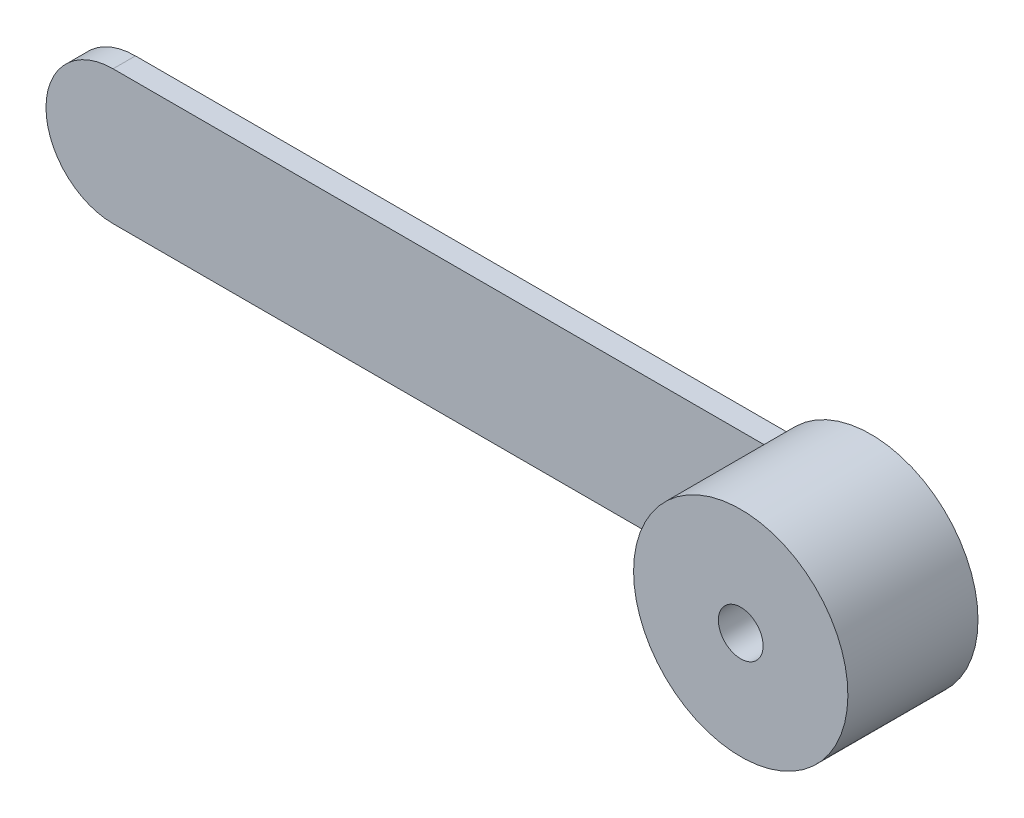
ISO-10303-21;
HEADER;
FILE_DESCRIPTION(('STEP AP214'),'2;1');
FILE_NAME('part.step','',(''),(''),'','','');
FILE_SCHEMA(('AUTOMOTIVE_DESIGN { 1 0 10303 214 1 1 1 1 }'));
ENDSEC;
DATA;
#1=APPLICATION_CONTEXT('core data for automotive mechanical design processes');
#2=APPLICATION_PROTOCOL_DEFINITION('international standard','automotive_design',2000,#1);
#3=PRODUCT_CONTEXT('',#1,'mechanical');
#4=PRODUCT('Part','Part','',(#3));
#5=PRODUCT_RELATED_PRODUCT_CATEGORY('part','',(#4));
#6=PRODUCT_DEFINITION_FORMATION('','',#4);
#7=PRODUCT_DEFINITION_CONTEXT('part definition',#1,'design');
#8=PRODUCT_DEFINITION('design','',#6,#7);
#9=PRODUCT_DEFINITION_SHAPE('','',#8);
#10=(LENGTH_UNIT() NAMED_UNIT(*) SI_UNIT(.MILLI.,.METRE.));
#11=(NAMED_UNIT(*) PLANE_ANGLE_UNIT() SI_UNIT($,.RADIAN.));
#12=(NAMED_UNIT(*) SI_UNIT($,.STERADIAN.) SOLID_ANGLE_UNIT());
#13=UNCERTAINTY_MEASURE_WITH_UNIT(LENGTH_MEASURE(1.E-05),#10,'distance_accuracy_value','');
#14=(GEOMETRIC_REPRESENTATION_CONTEXT(3) GLOBAL_UNCERTAINTY_ASSIGNED_CONTEXT((#13)) GLOBAL_UNIT_ASSIGNED_CONTEXT((#10,
#11,#12)) REPRESENTATION_CONTEXT('',''));
#15=CARTESIAN_POINT('',(0.,0.,0.));
#16=DIRECTION('',(0.,0.,1.));
#17=DIRECTION('',(1.,0.,0.));
#18=AXIS2_PLACEMENT_3D('',#15,#16,#17);
#19=CARTESIAN_POINT('',(0.,0.,0.));
#20=DIRECTION('',(0.,0.,-1.));
#21=DIRECTION('',(-1.,0.,0.));
#22=AXIS2_PLACEMENT_3D('',#19,#20,#21);
#23=PLANE('',#22);
#24=CARTESIAN_POINT('',(200.,25.,0.));
#25=DIRECTION('',(0.,0.,-1.));
#26=DIRECTION('',(-1.,0.,0.));
#27=AXIS2_PLACEMENT_3D('',#24,#25,#26);
#28=CIRCLE('',#27,4.99999999999999);
#29=CARTESIAN_POINT('',(205.,25.,0.));
#30=VERTEX_POINT('',#29);
#31=EDGE_CURVE('E103',#30,#30,#28,.T.);
#32=ORIENTED_EDGE('',*,*,#31,.F.);
#33=EDGE_LOOP('',(#32));
#34=FACE_BOUND('',#33,.T.);
#35=DIRECTION('',(-1.,0.,0.));
#36=VECTOR('',#35,1.);
#37=CARTESIAN_POINT('',(200.,40.,0.));
#38=LINE('',#37,#36);
#39=CARTESIAN_POINT('',(181.309598594319,40.,0.));
#40=VERTEX_POINT('',#39);
#41=CARTESIAN_POINT('',(35.5377506602539,40.,0.));
#42=VERTEX_POINT('',#41);
#43=EDGE_CURVE('E49',#40,#42,#38,.T.);
#44=ORIENTED_EDGE('',*,*,#43,.F.);
#45=CARTESIAN_POINT('',(200.,25.,0.));
#46=DIRECTION('',(0.,0.,-1.));
#47=DIRECTION('',(-1.,0.,0.));
#48=AXIS2_PLACEMENT_3D('',#45,#46,#47);
#49=CIRCLE('',#48,23.9652061269138);
#50=CARTESIAN_POINT('',(181.309598594319,10.,0.));
#51=VERTEX_POINT('',#50);
#52=EDGE_CURVE('E104',#40,#51,#49,.T.);
#53=ORIENTED_EDGE('',*,*,#52,.T.);
#54=DIRECTION('',(-1.,0.,0.));
#55=VECTOR('',#54,1.);
#56=CARTESIAN_POINT('',(200.,10.,1.17566092718146E-13));
#57=LINE('',#56,#55);
#58=CARTESIAN_POINT('',(35.5377506602539,10.,0.));
#59=VERTEX_POINT('',#58);
#60=EDGE_CURVE('E91',#51,#59,#57,.T.);
#61=ORIENTED_EDGE('',*,*,#60,.T.);
#62=CARTESIAN_POINT('',(35.5377506602539,25.,0.));
#63=DIRECTION('',(0.,0.,-1.));
#64=DIRECTION('',(1.,0.,0.));
#65=AXIS2_PLACEMENT_3D('',#62,#63,#64);
#66=CIRCLE('',#65,15.);
#67=EDGE_CURVE('E64',#59,#42,#66,.T.);
#68=ORIENTED_EDGE('',*,*,#67,.T.);
#69=EDGE_LOOP('',(#44,#53,#61,#68));
#70=FACE_BOUND('',#69,.T.);
#71=ADVANCED_FACE('F41',(#34,#70),#23,.T.);
#72=CARTESIAN_POINT('',(200.,40.,5.));
#73=DIRECTION('',(0.,0.,-1.));
#74=DIRECTION('',(0.,1.,0.));
#75=AXIS2_PLACEMENT_3D('',#72,#73,#74);
#76=PLANE('',#75);
#77=CARTESIAN_POINT('',(200.,25.,5.));
#78=DIRECTION('',(0.,0.,-1.));
#79=DIRECTION('',(0.,1.,0.));
#80=AXIS2_PLACEMENT_3D('',#77,#78,#79);
#81=CIRCLE('',#80,23.9652061269138);
#82=CARTESIAN_POINT('',(181.309598594319,40.,5.00000000000001));
#83=VERTEX_POINT('',#82);
#84=CARTESIAN_POINT('',(181.309598594319,10.,4.99999999999999));
#85=VERTEX_POINT('',#84);
#86=EDGE_CURVE('E88',#83,#85,#81,.F.);
#87=ORIENTED_EDGE('',*,*,#86,.F.);
#88=DIRECTION('',(-1.,0.,0.));
#89=VECTOR('',#88,1.);
#90=CARTESIAN_POINT('',(200.,40.,5.));
#91=LINE('',#90,#89);
#92=CARTESIAN_POINT('',(35.5377506602539,40.,5.00000000000002));
#93=VERTEX_POINT('',#92);
#94=EDGE_CURVE('E56',#83,#93,#91,.T.);
#95=ORIENTED_EDGE('',*,*,#94,.T.);
#96=CARTESIAN_POINT('',(35.5377506602539,25.,4.99999999999991));
#97=DIRECTION('',(0.,0.,1.));
#98=DIRECTION('',(0.,-1.,0.));
#99=AXIS2_PLACEMENT_3D('',#96,#97,#98);
#100=CIRCLE('',#99,15.);
#101=CARTESIAN_POINT('',(35.5377506602539,10.,4.99999999999981));
#102=VERTEX_POINT('',#101);
#103=EDGE_CURVE('E12',#102,#93,#100,.F.);
#104=ORIENTED_EDGE('',*,*,#103,.F.);
#105=DIRECTION('',(-1.,0.,0.));
#106=VECTOR('',#105,1.);
#107=CARTESIAN_POINT('',(200.,10.,5.));
#108=LINE('',#107,#106);
#109=EDGE_CURVE('E84',#85,#102,#108,.T.);
#110=ORIENTED_EDGE('',*,*,#109,.F.);
#111=EDGE_LOOP('',(#87,#95,#104,#110));
#112=FACE_BOUND('',#111,.T.);
#113=ADVANCED_FACE('F86',(#112),#76,.F.);
#114=CARTESIAN_POINT('',(200.,40.,0.));
#115=DIRECTION('',(0.,-1.,0.));
#116=DIRECTION('',(0.,0.,-1.));
#117=AXIS2_PLACEMENT_3D('',#114,#115,#116);
#118=PLANE('',#117);
#119=DIRECTION('',(0.,0.,-1.));
#120=VECTOR('',#119,1.);
#121=CARTESIAN_POINT('',(35.5377506602539,40.,60.));
#122=LINE('',#121,#120);
#123=EDGE_CURVE('E112',#93,#42,#122,.T.);
#124=ORIENTED_EDGE('',*,*,#123,.F.);
#125=ORIENTED_EDGE('',*,*,#94,.F.);
#126=DIRECTION('',(0.,0.,1.));
#127=VECTOR('',#126,1.);
#128=CARTESIAN_POINT('',(181.309598594319,40.,-42.));
#129=LINE('',#128,#127);
#130=EDGE_CURVE('E99',#40,#83,#129,.T.);
#131=ORIENTED_EDGE('',*,*,#130,.F.);
#132=ORIENTED_EDGE('',*,*,#43,.T.);
#133=EDGE_LOOP('',(#124,#125,#131,#132));
#134=FACE_BOUND('',#133,.T.);
#135=ADVANCED_FACE('F118',(#134),#118,.F.);
#136=CARTESIAN_POINT('',(200.,10.,1.17566092718146E-13));
#137=DIRECTION('',(0.,1.,0.));
#138=DIRECTION('',(0.,0.,1.));
#139=AXIS2_PLACEMENT_3D('',#136,#137,#138);
#140=PLANE('',#139);
#141=ORIENTED_EDGE('',*,*,#109,.T.);
#142=DIRECTION('',(0.,0.,-1.));
#143=VECTOR('',#142,1.);
#144=CARTESIAN_POINT('',(35.5377506602539,10.,60.));
#145=LINE('',#144,#143);
#146=EDGE_CURVE('E111',#102,#59,#145,.T.);
#147=ORIENTED_EDGE('',*,*,#146,.T.);
#148=ORIENTED_EDGE('',*,*,#60,.F.);
#149=DIRECTION('',(0.,0.,1.));
#150=VECTOR('',#149,1.);
#151=CARTESIAN_POINT('',(181.309598594319,10.,-42.));
#152=LINE('',#151,#150);
#153=EDGE_CURVE('E94',#51,#85,#152,.T.);
#154=ORIENTED_EDGE('',*,*,#153,.T.);
#155=EDGE_LOOP('',(#141,#147,#148,#154));
#156=FACE_BOUND('',#155,.T.);
#157=ADVANCED_FACE('F95',(#156),#140,.F.);
#158=CARTESIAN_POINT('',(35.5377506602539,25.,60.));
#159=DIRECTION('',(0.,0.,-1.));
#160=DIRECTION('',(-1.,0.,0.));
#161=AXIS2_PLACEMENT_3D('',#158,#159,#160);
#162=CYLINDRICAL_SURFACE('',#161,15.);
#163=ORIENTED_EDGE('',*,*,#146,.F.);
#164=ORIENTED_EDGE('',*,*,#103,.T.);
#165=ORIENTED_EDGE('',*,*,#123,.T.);
#166=ORIENTED_EDGE('',*,*,#67,.F.);
#167=EDGE_LOOP('',(#163,#164,#165,#166));
#168=FACE_BOUND('',#167,.T.);
#169=ADVANCED_FACE('F120',(#168),#162,.T.);
#170=CARTESIAN_POINT('',(200.,25.,-10.));
#171=DIRECTION('',(0.,0.,1.));
#172=DIRECTION('',(1.,0.,0.));
#173=AXIS2_PLACEMENT_3D('',#170,#171,#172);
#174=CYLINDRICAL_SURFACE('',#173,4.99999999999999);
#175=CARTESIAN_POINT('',(200.,25.,29.0948117433159));
#176=DIRECTION('',(0.,0.,-1.));
#177=DIRECTION('',(-1.,0.,0.));
#178=AXIS2_PLACEMENT_3D('',#175,#176,#177);
#179=CIRCLE('',#178,4.99999999999999);
#180=CARTESIAN_POINT('',(205.,25.,29.0948117433159));
#181=VERTEX_POINT('',#180);
#182=EDGE_CURVE('E100',#181,#181,#179,.F.);
#183=CARTESIAN_POINT('',(205.,25.,29.0948117433159));
#184=CARTESIAN_POINT('',(205.,25.,28.7917407876564));
#185=CARTESIAN_POINT('',(205.,25.,28.4886698319968));
#186=CARTESIAN_POINT('',(205.,25.,27.8825279206777));
#187=CARTESIAN_POINT('',(205.,25.,27.5794569650182));
#188=CARTESIAN_POINT('',(205.,25.,26.9733150536991));
#189=CARTESIAN_POINT('',(205.,25.,26.6702440980396));
#190=CARTESIAN_POINT('',(205.,25.,26.0641021867205));
#191=CARTESIAN_POINT('',(205.,25.,25.7610312310609));
#192=CARTESIAN_POINT('',(205.,25.,25.1548893197419));
#193=CARTESIAN_POINT('',(205.,25.,24.8518183640823));
#194=CARTESIAN_POINT('',(205.,25.,24.2456764527632));
#195=CARTESIAN_POINT('',(205.,25.,23.9426054971037));
#196=CARTESIAN_POINT('',(205.,25.,23.3364635857846));
#197=CARTESIAN_POINT('',(205.,25.,23.0333926301251));
#198=CARTESIAN_POINT('',(205.,25.,22.427250718806));
#199=CARTESIAN_POINT('',(205.,25.,22.1241797631465));
#200=CARTESIAN_POINT('',(205.,25.,21.5180378518274));
#201=CARTESIAN_POINT('',(205.,25.,21.2149668961678));
#202=CARTESIAN_POINT('',(205.,25.,20.6088249848488));
#203=CARTESIAN_POINT('',(205.,25.,20.3057540291892));
#204=CARTESIAN_POINT('',(205.,25.,19.6996121178701));
#205=CARTESIAN_POINT('',(205.,25.,19.3965411622106));
#206=CARTESIAN_POINT('',(205.,25.,18.7903992508915));
#207=CARTESIAN_POINT('',(205.,25.,18.487328295232));
#208=CARTESIAN_POINT('',(205.,25.,17.8811863839129));
#209=CARTESIAN_POINT('',(205.,25.,17.5781154282534));
#210=CARTESIAN_POINT('',(205.,25.,16.9719735169343));
#211=CARTESIAN_POINT('',(205.,25.,16.6689025612747));
#212=CARTESIAN_POINT('',(205.,25.,16.0627606499556));
#213=CARTESIAN_POINT('',(205.,25.,15.7596896942961));
#214=CARTESIAN_POINT('',(205.,25.,15.153547782977));
#215=CARTESIAN_POINT('',(205.,25.,14.8504768273175));
#216=CARTESIAN_POINT('',(205.,25.,14.2443349159984));
#217=CARTESIAN_POINT('',(205.,25.,13.9412639603389));
#218=CARTESIAN_POINT('',(205.,25.,13.3351220490198));
#219=CARTESIAN_POINT('',(205.,25.,13.0320510933602));
#220=CARTESIAN_POINT('',(205.,25.,12.4259091820412));
#221=CARTESIAN_POINT('',(205.,25.,12.1228382263816));
#222=CARTESIAN_POINT('',(205.,25.,11.5166963150625));
#223=CARTESIAN_POINT('',(205.,25.,11.213625359403));
#224=CARTESIAN_POINT('',(205.,25.,10.6074834480839));
#225=CARTESIAN_POINT('',(205.,25.,10.3044124924244));
#226=CARTESIAN_POINT('',(205.,25.,9.6982705811053));
#227=CARTESIAN_POINT('',(205.,25.,9.39519962544576));
#228=CARTESIAN_POINT('',(205.,25.,8.78905771412668));
#229=CARTESIAN_POINT('',(205.,25.,8.48598675846714));
#230=CARTESIAN_POINT('',(205.,25.,7.87984484714806));
#231=CARTESIAN_POINT('',(205.,25.,7.57677389148851));
#232=CARTESIAN_POINT('',(205.,25.,6.97063198016943));
#233=CARTESIAN_POINT('',(205.,25.,6.66756102450989));
#234=CARTESIAN_POINT('',(205.,25.,6.06141911319081));
#235=CARTESIAN_POINT('',(205.,25.,5.75834815753127));
#236=CARTESIAN_POINT('',(205.,25.,5.15220624621219));
#237=CARTESIAN_POINT('',(205.,25.,4.84913529055265));
#238=CARTESIAN_POINT('',(205.,25.,4.24299337923357));
#239=CARTESIAN_POINT('',(205.,25.,3.93992242357403));
#240=CARTESIAN_POINT('',(205.,25.,3.33378051225495));
#241=CARTESIAN_POINT('',(205.,25.,3.03070955659541));
#242=CARTESIAN_POINT('',(205.,25.,2.42456764527633));
#243=CARTESIAN_POINT('',(205.,25.,2.12149668961679));
#244=CARTESIAN_POINT('',(205.,25.,1.5153547782977));
#245=CARTESIAN_POINT('',(205.,25.,1.21228382263816));
#246=CARTESIAN_POINT('',(205.,25.,0.606141911319082));
#247=CARTESIAN_POINT('',(205.,25.,0.303070955659542));
#248=CARTESIAN_POINT('',(205.,25.,0.));
#249=B_SPLINE_CURVE_WITH_KNOTS('',3,(#183,#184,#185,#186,#187,#188,#189,#190,#191,#192,#193,
#194,#195,#196,#197,#198,#199,#200,#201,#202,#203,#204,#205,#206,#207,#208,#209,#210,#211,#212,
#213,#214,#215,#216,#217,#218,#219,#220,#221,#222,#223,#224,#225,#226,#227,#228,#229,#230,#231,
#232,#233,#234,#235,#236,#237,#238,#239,#240,#241,#242,#243,#244,#245,#246,#247,#248),
.UNSPECIFIED.,.F.,.F.,(4,2,2,2,2,2,2,2,2,2,2,2,2,2,2,2,2,2,2,2,2,2,2,2,2,2,2,2,2,2,2,2,4),(0.,
0.90921286697862,1.81842573395724,2.72763860093587,3.63685146791449,4.54606433489311,
5.45527720187173,6.36449006885035,7.27370293582898,8.18291580280759,9.09212866978621,
10.0013415367648,10.9105544037435,11.8197672707221,12.7289801377007,13.6381930046793,
14.5474058716579,15.4566187386366,16.3658316056152,17.2750444725938,18.1842573395724,
19.0934702065511,20.0026830735297,20.9118959405083,21.8211088074869,22.7303216744655,
23.6395345414442,24.5487474084228,25.4579602754014,26.36717314238,27.2763860093586,
28.1855988763373,29.0948117433159),.UNSPECIFIED.);
#250=EDGE_CURVE('BSEAM122',#181,#30,#249,.T.);
#251=ORIENTED_EDGE('',*,*,#182,.T.);
#252=ORIENTED_EDGE('',*,*,#31,.T.);
#253=ORIENTED_EDGE('',*,*,#250,.T.);
#254=ORIENTED_EDGE('',*,*,#250,.F.);
#255=EDGE_LOOP('',(#251,#253,#252,#254));
#256=FACE_BOUND('',#255,.T.);
#257=ADVANCED_FACE('F122',(#256),#174,.F.);
#258=CARTESIAN_POINT('',(200.,25.,-225.078823303855));
#259=DIRECTION('',(0.,0.,1.));
#260=DIRECTION('',(1.,0.,0.));
#261=AXIS2_PLACEMENT_3D('',#258,#259,#260);
#262=CYLINDRICAL_SURFACE('',#261,23.9652061269138);
#263=CARTESIAN_POINT('',(200.,25.,29.0948117433159));
#264=DIRECTION('',(0.,0.,-1.));
#265=DIRECTION('',(-1.,0.,0.));
#266=AXIS2_PLACEMENT_3D('',#263,#264,#265);
#267=CIRCLE('',#266,23.9652061269138);
#268=CARTESIAN_POINT('',(176.034793873086,25.,29.0948117433161));
#269=VERTEX_POINT('',#268);
#270=EDGE_CURVE('E44',#269,#269,#267,.F.);
#271=ORIENTED_EDGE('',*,*,#270,.F.);
#272=EDGE_LOOP('',(#271));
#273=FACE_BOUND('',#272,.T.);
#274=ORIENTED_EDGE('',*,*,#86,.T.);
#275=ORIENTED_EDGE('',*,*,#153,.F.);
#276=ORIENTED_EDGE('',*,*,#52,.F.);
#277=ORIENTED_EDGE('',*,*,#130,.T.);
#278=EDGE_LOOP('',(#274,#275,#276,#277));
#279=FACE_BOUND('',#278,.T.);
#280=ADVANCED_FACE('F102',(#273,#279),#262,.T.);
#281=CARTESIAN_POINT('',(232.409731391026,-8.50000000000015,29.0948117433155));
#282=DIRECTION('',(0.,0.,-1.));
#283=DIRECTION('',(-1.,0.,0.));
#284=AXIS2_PLACEMENT_3D('',#281,#282,#283);
#285=PLANE('',#284);
#286=ORIENTED_EDGE('',*,*,#270,.T.);
#287=EDGE_LOOP('',(#286));
#288=FACE_BOUND('',#287,.T.);
#289=ORIENTED_EDGE('',*,*,#182,.F.);
#290=EDGE_LOOP('',(#289));
#291=FACE_BOUND('',#290,.T.);
#292=ADVANCED_FACE('F166',(#288,#291),#285,.F.);
#293=CLOSED_SHELL('',(#71,#113,#135,#157,#169,#257,#280,#292));
#294=MANIFOLD_SOLID_BREP('B2',#293);
#295=ADVANCED_BREP_SHAPE_REPRESENTATION('',(#18,#294),#14);
#296=SHAPE_DEFINITION_REPRESENTATION(#9,#295);
ENDSEC;
END-ISO-10303-21;
